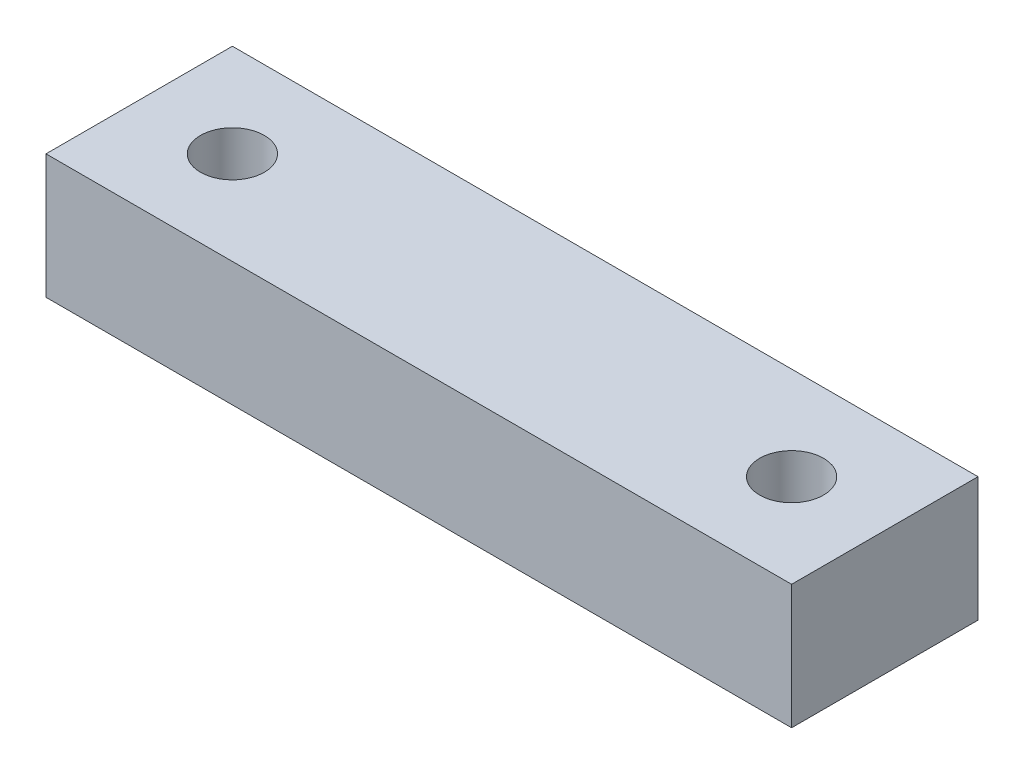
ISO-10303-21;
HEADER;
FILE_DESCRIPTION(('STEP AP214'),'2;1');
FILE_NAME('part.step','',(''),(''),'','','');
FILE_SCHEMA(('AUTOMOTIVE_DESIGN { 1 0 10303 214 1 1 1 1 }'));
ENDSEC;
DATA;
#1=APPLICATION_CONTEXT('core data for automotive mechanical design processes');
#2=APPLICATION_PROTOCOL_DEFINITION('international standard','automotive_design',2000,#1);
#3=PRODUCT_CONTEXT('',#1,'mechanical');
#4=PRODUCT('Part','Part','',(#3));
#5=PRODUCT_RELATED_PRODUCT_CATEGORY('part','',(#4));
#6=PRODUCT_DEFINITION_FORMATION('','',#4);
#7=PRODUCT_DEFINITION_CONTEXT('part definition',#1,'design');
#8=PRODUCT_DEFINITION('design','',#6,#7);
#9=PRODUCT_DEFINITION_SHAPE('','',#8);
#10=(LENGTH_UNIT() NAMED_UNIT(*) SI_UNIT(.MILLI.,.METRE.));
#11=(NAMED_UNIT(*) PLANE_ANGLE_UNIT() SI_UNIT($,.RADIAN.));
#12=(NAMED_UNIT(*) SI_UNIT($,.STERADIAN.) SOLID_ANGLE_UNIT());
#13=UNCERTAINTY_MEASURE_WITH_UNIT(LENGTH_MEASURE(1.E-05),#10,'distance_accuracy_value','');
#14=(GEOMETRIC_REPRESENTATION_CONTEXT(3) GLOBAL_UNCERTAINTY_ASSIGNED_CONTEXT((#13)) GLOBAL_UNIT_ASSIGNED_CONTEXT((#10,
#11,#12)) REPRESENTATION_CONTEXT('',''));
#15=CARTESIAN_POINT('',(0.,0.,0.));
#16=DIRECTION('',(0.,0.,1.));
#17=DIRECTION('',(1.,0.,0.));
#18=AXIS2_PLACEMENT_3D('',#15,#16,#17);
#19=CARTESIAN_POINT('',(0.,6.35,0.));
#20=DIRECTION('',(0.,-1.,0.));
#21=DIRECTION('',(0.,0.,-1.));
#22=AXIS2_PLACEMENT_3D('',#19,#20,#21);
#23=PLANE('',#22);
#24=DIRECTION('',(0.,0.,-1.));
#25=VECTOR('',#24,1.);
#26=CARTESIAN_POINT('',(19.05,6.35,4.7625));
#27=LINE('',#26,#25);
#28=CARTESIAN_POINT('',(19.05,6.35,4.7625));
#29=VERTEX_POINT('',#28);
#30=CARTESIAN_POINT('',(19.05,6.35,-4.7625));
#31=VERTEX_POINT('',#30);
#32=EDGE_CURVE('E86',#29,#31,#27,.T.);
#33=ORIENTED_EDGE('',*,*,#32,.T.);
#34=DIRECTION('',(-1.,0.,0.));
#35=VECTOR('',#34,1.);
#36=CARTESIAN_POINT('',(-19.05,6.35,-4.7625));
#37=LINE('',#36,#35);
#38=CARTESIAN_POINT('',(-19.05,6.35,-4.7625));
#39=VERTEX_POINT('',#38);
#40=EDGE_CURVE('E81',#31,#39,#37,.T.);
#41=ORIENTED_EDGE('',*,*,#40,.T.);
#42=DIRECTION('',(0.,0.,1.));
#43=VECTOR('',#42,1.);
#44=CARTESIAN_POINT('',(-19.05,6.35,4.7625));
#45=LINE('',#44,#43);
#46=CARTESIAN_POINT('',(-19.05,6.35,4.7625));
#47=VERTEX_POINT('',#46);
#48=EDGE_CURVE('E84',#39,#47,#45,.T.);
#49=ORIENTED_EDGE('',*,*,#48,.T.);
#50=DIRECTION('',(1.,0.,0.));
#51=VECTOR('',#50,1.);
#52=CARTESIAN_POINT('',(-19.05,6.35,4.7625));
#53=LINE('',#52,#51);
#54=EDGE_CURVE('E51',#47,#29,#53,.T.);
#55=ORIENTED_EDGE('',*,*,#54,.T.);
#56=EDGE_LOOP('',(#33,#41,#49,#55));
#57=FACE_BOUND('',#56,.T.);
#58=CARTESIAN_POINT('',(-14.2875,6.35,0.));
#59=DIRECTION('',(0.,1.,0.));
#60=DIRECTION('',(0.,0.,1.));
#61=AXIS2_PLACEMENT_3D('',#58,#59,#60);
#62=CIRCLE('',#61,1.63194999999999);
#63=CARTESIAN_POINT('',(-14.2875,6.35,1.63194999999999));
#64=VERTEX_POINT('',#63);
#65=EDGE_CURVE('E114',#64,#64,#62,.T.);
#66=ORIENTED_EDGE('',*,*,#65,.F.);
#67=EDGE_LOOP('',(#66));
#68=FACE_BOUND('',#67,.T.);
#69=CARTESIAN_POINT('',(14.2875,6.35,0.));
#70=DIRECTION('',(0.,1.,0.));
#71=DIRECTION('',(0.,0.,1.));
#72=AXIS2_PLACEMENT_3D('',#69,#70,#71);
#73=CIRCLE('',#72,1.63194999999999);
#74=CARTESIAN_POINT('',(14.2875,6.35,1.63194999999999));
#75=VERTEX_POINT('',#74);
#76=EDGE_CURVE('E120',#75,#75,#73,.T.);
#77=ORIENTED_EDGE('',*,*,#76,.F.);
#78=EDGE_LOOP('',(#77));
#79=FACE_BOUND('',#78,.T.);
#80=ADVANCED_FACE('F34',(#57,#68,#79),#23,.F.);
#81=CARTESIAN_POINT('',(19.05,6.35,4.7625));
#82=DIRECTION('',(-1.,0.,0.));
#83=DIRECTION('',(0.,0.,1.));
#84=AXIS2_PLACEMENT_3D('',#81,#82,#83);
#85=PLANE('',#84);
#86=DIRECTION('',(0.,0.,-1.));
#87=VECTOR('',#86,1.);
#88=CARTESIAN_POINT('',(19.05,0.,4.7625));
#89=LINE('',#88,#87);
#90=CARTESIAN_POINT('',(19.05,0.,4.7625));
#91=VERTEX_POINT('',#90);
#92=CARTESIAN_POINT('',(19.05,0.,-4.7625));
#93=VERTEX_POINT('',#92);
#94=EDGE_CURVE('E98',#91,#93,#89,.T.);
#95=ORIENTED_EDGE('',*,*,#94,.T.);
#96=DIRECTION('',(0.,-1.,0.));
#97=VECTOR('',#96,1.);
#98=CARTESIAN_POINT('',(19.05,6.35,-4.7625));
#99=LINE('',#98,#97);
#100=EDGE_CURVE('E11',#31,#93,#99,.T.);
#101=ORIENTED_EDGE('',*,*,#100,.F.);
#102=ORIENTED_EDGE('',*,*,#32,.F.);
#103=DIRECTION('',(0.,-1.,0.));
#104=VECTOR('',#103,1.);
#105=CARTESIAN_POINT('',(19.05,6.35,4.7625));
#106=LINE('',#105,#104);
#107=EDGE_CURVE('E94',#29,#91,#106,.T.);
#108=ORIENTED_EDGE('',*,*,#107,.T.);
#109=EDGE_LOOP('',(#95,#101,#102,#108));
#110=FACE_BOUND('',#109,.T.);
#111=ADVANCED_FACE('F36',(#110),#85,.F.);
#112=CARTESIAN_POINT('',(-19.05,6.35,-4.7625));
#113=DIRECTION('',(0.,0.,1.));
#114=DIRECTION('',(1.,0.,0.));
#115=AXIS2_PLACEMENT_3D('',#112,#113,#114);
#116=PLANE('',#115);
#117=DIRECTION('',(-1.,0.,0.));
#118=VECTOR('',#117,1.);
#119=CARTESIAN_POINT('',(-19.05,0.,-4.7625));
#120=LINE('',#119,#118);
#121=CARTESIAN_POINT('',(-19.05,0.,-4.7625));
#122=VERTEX_POINT('',#121);
#123=EDGE_CURVE('E90',#93,#122,#120,.T.);
#124=ORIENTED_EDGE('',*,*,#123,.T.);
#125=DIRECTION('',(0.,-1.,0.));
#126=VECTOR('',#125,1.);
#127=CARTESIAN_POINT('',(-19.05,6.35,-4.7625));
#128=LINE('',#127,#126);
#129=EDGE_CURVE('E43',#39,#122,#128,.T.);
#130=ORIENTED_EDGE('',*,*,#129,.F.);
#131=ORIENTED_EDGE('',*,*,#40,.F.);
#132=ORIENTED_EDGE('',*,*,#100,.T.);
#133=EDGE_LOOP('',(#124,#130,#131,#132));
#134=FACE_BOUND('',#133,.T.);
#135=ADVANCED_FACE('F89',(#134),#116,.F.);
#136=CARTESIAN_POINT('',(-19.05,6.35,4.7625));
#137=DIRECTION('',(1.,0.,0.));
#138=DIRECTION('',(0.,0.,-1.));
#139=AXIS2_PLACEMENT_3D('',#136,#137,#138);
#140=PLANE('',#139);
#141=DIRECTION('',(0.,0.,1.));
#142=VECTOR('',#141,1.);
#143=CARTESIAN_POINT('',(-19.05,0.,4.7625));
#144=LINE('',#143,#142);
#145=CARTESIAN_POINT('',(-19.05,0.,4.7625));
#146=VERTEX_POINT('',#145);
#147=EDGE_CURVE('E68',#122,#146,#144,.T.);
#148=ORIENTED_EDGE('',*,*,#147,.T.);
#149=DIRECTION('',(0.,-1.,0.));
#150=VECTOR('',#149,1.);
#151=CARTESIAN_POINT('',(-19.05,6.35,4.7625));
#152=LINE('',#151,#150);
#153=EDGE_CURVE('E91',#47,#146,#152,.T.);
#154=ORIENTED_EDGE('',*,*,#153,.F.);
#155=ORIENTED_EDGE('',*,*,#48,.F.);
#156=ORIENTED_EDGE('',*,*,#129,.T.);
#157=EDGE_LOOP('',(#148,#154,#155,#156));
#158=FACE_BOUND('',#157,.T.);
#159=ADVANCED_FACE('F92',(#158),#140,.F.);
#160=CARTESIAN_POINT('',(-19.05,6.35,4.7625));
#161=DIRECTION('',(0.,0.,-1.));
#162=DIRECTION('',(-1.,0.,0.));
#163=AXIS2_PLACEMENT_3D('',#160,#161,#162);
#164=PLANE('',#163);
#165=DIRECTION('',(1.,0.,0.));
#166=VECTOR('',#165,1.);
#167=CARTESIAN_POINT('',(-19.05,0.,4.7625));
#168=LINE('',#167,#166);
#169=EDGE_CURVE('E74',#146,#91,#168,.T.);
#170=ORIENTED_EDGE('',*,*,#169,.T.);
#171=ORIENTED_EDGE('',*,*,#107,.F.);
#172=ORIENTED_EDGE('',*,*,#54,.F.);
#173=ORIENTED_EDGE('',*,*,#153,.T.);
#174=EDGE_LOOP('',(#170,#171,#172,#173));
#175=FACE_BOUND('',#174,.T.);
#176=ADVANCED_FACE('F106',(#175),#164,.F.);
#177=CARTESIAN_POINT('',(0.,0.,0.));
#178=DIRECTION('',(0.,-1.,0.));
#179=DIRECTION('',(0.,0.,-1.));
#180=AXIS2_PLACEMENT_3D('',#177,#178,#179);
#181=PLANE('',#180);
#182=CARTESIAN_POINT('',(14.2875,0.,0.));
#183=DIRECTION('',(0.,-1.,0.));
#184=DIRECTION('',(0.,0.,-1.));
#185=AXIS2_PLACEMENT_3D('',#182,#183,#184);
#186=CIRCLE('',#185,1.63194999999999);
#187=CARTESIAN_POINT('',(14.2875,0.,-1.63194999999999));
#188=VERTEX_POINT('',#187);
#189=EDGE_CURVE('E117',#188,#188,#186,.T.);
#190=ORIENTED_EDGE('',*,*,#189,.F.);
#191=EDGE_LOOP('',(#190));
#192=FACE_BOUND('',#191,.T.);
#193=CARTESIAN_POINT('',(-14.2875,0.,0.));
#194=DIRECTION('',(0.,-1.,0.));
#195=DIRECTION('',(0.,0.,-1.));
#196=AXIS2_PLACEMENT_3D('',#193,#194,#195);
#197=CIRCLE('',#196,1.63194999999999);
#198=CARTESIAN_POINT('',(-14.2875,0.,-1.63194999999999));
#199=VERTEX_POINT('',#198);
#200=EDGE_CURVE('E101',#199,#199,#197,.T.);
#201=ORIENTED_EDGE('',*,*,#200,.F.);
#202=EDGE_LOOP('',(#201));
#203=FACE_BOUND('',#202,.T.);
#204=ORIENTED_EDGE('',*,*,#94,.F.);
#205=ORIENTED_EDGE('',*,*,#169,.F.);
#206=ORIENTED_EDGE('',*,*,#147,.F.);
#207=ORIENTED_EDGE('',*,*,#123,.F.);
#208=EDGE_LOOP('',(#204,#205,#206,#207));
#209=FACE_BOUND('',#208,.T.);
#210=ADVANCED_FACE('F109',(#192,#203,#209),#181,.T.);
#211=CARTESIAN_POINT('',(-14.2875,6.35,0.));
#212=DIRECTION('',(0.,1.,0.));
#213=DIRECTION('',(0.,0.,1.));
#214=AXIS2_PLACEMENT_3D('',#211,#212,#213);
#215=CYLINDRICAL_SURFACE('',#214,1.63194999999999);
#216=ORIENTED_EDGE('',*,*,#65,.T.);
#217=EDGE_LOOP('',(#216));
#218=FACE_BOUND('',#217,.T.);
#219=ORIENTED_EDGE('',*,*,#200,.T.);
#220=EDGE_LOOP('',(#219));
#221=FACE_BOUND('',#220,.T.);
#222=ADVANCED_FACE('F134',(#218,#221),#215,.F.);
#223=CARTESIAN_POINT('',(14.2875,6.35,0.));
#224=DIRECTION('',(0.,1.,0.));
#225=DIRECTION('',(0.,0.,1.));
#226=AXIS2_PLACEMENT_3D('',#223,#224,#225);
#227=CYLINDRICAL_SURFACE('',#226,1.63194999999999);
#228=ORIENTED_EDGE('',*,*,#76,.T.);
#229=EDGE_LOOP('',(#228));
#230=FACE_BOUND('',#229,.T.);
#231=ORIENTED_EDGE('',*,*,#189,.T.);
#232=EDGE_LOOP('',(#231));
#233=FACE_BOUND('',#232,.T.);
#234=ADVANCED_FACE('F124',(#230,#233),#227,.F.);
#235=CLOSED_SHELL('',(#80,#111,#135,#159,#176,#210,#222,#234));
#236=MANIFOLD_SOLID_BREP('B2',#235);
#237=ADVANCED_BREP_SHAPE_REPRESENTATION('',(#18,#236),#14);
#238=SHAPE_DEFINITION_REPRESENTATION(#9,#237);
ENDSEC;
END-ISO-10303-21;
